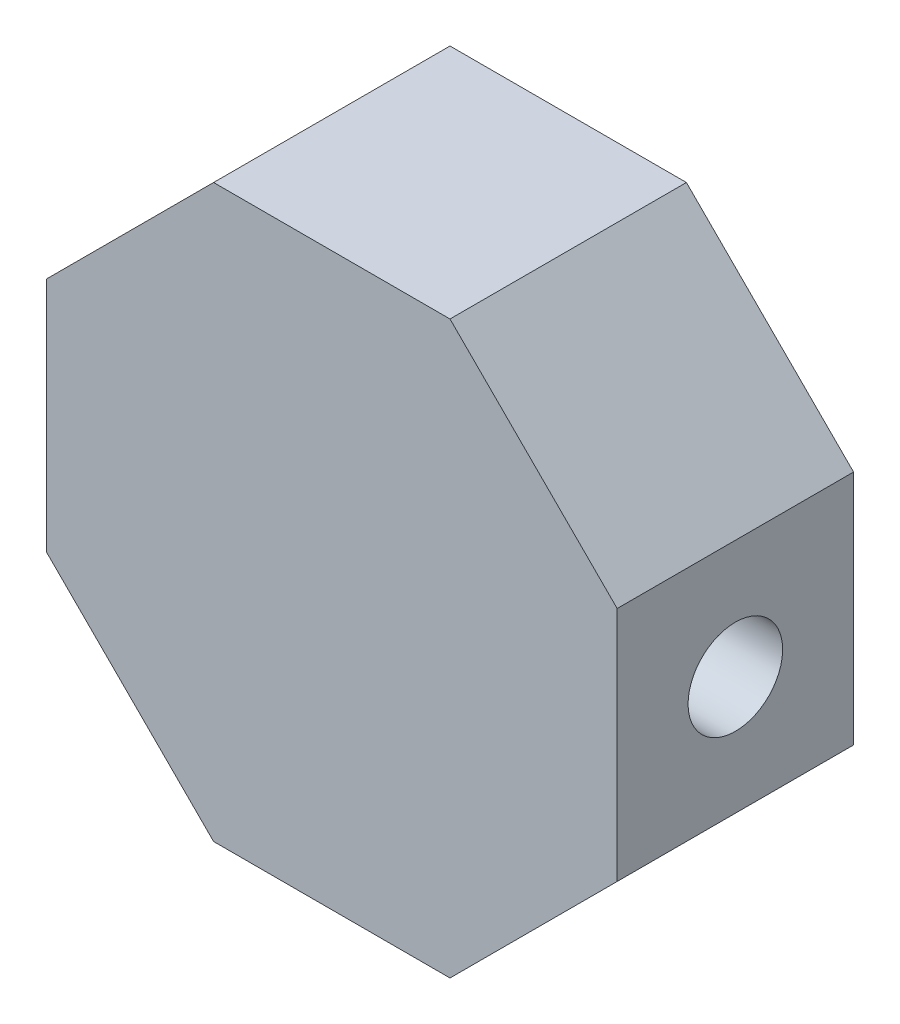
ISO-10303-21;
HEADER;
FILE_DESCRIPTION(('STEP AP214'),'2;1');
FILE_NAME('part.step','',(''),(''),'','','');
FILE_SCHEMA(('AUTOMOTIVE_DESIGN { 1 0 10303 214 1 1 1 1 }'));
ENDSEC;
DATA;
#1=APPLICATION_CONTEXT('core data for automotive mechanical design processes');
#2=APPLICATION_PROTOCOL_DEFINITION('international standard','automotive_design',2000,#1);
#3=PRODUCT_CONTEXT('',#1,'mechanical');
#4=PRODUCT('Part','Part','',(#3));
#5=PRODUCT_RELATED_PRODUCT_CATEGORY('part','',(#4));
#6=PRODUCT_DEFINITION_FORMATION('','',#4);
#7=PRODUCT_DEFINITION_CONTEXT('part definition',#1,'design');
#8=PRODUCT_DEFINITION('design','',#6,#7);
#9=PRODUCT_DEFINITION_SHAPE('','',#8);
#10=(LENGTH_UNIT() NAMED_UNIT(*) SI_UNIT(.MILLI.,.METRE.));
#11=(NAMED_UNIT(*) PLANE_ANGLE_UNIT() SI_UNIT($,.RADIAN.));
#12=(NAMED_UNIT(*) SI_UNIT($,.STERADIAN.) SOLID_ANGLE_UNIT());
#13=UNCERTAINTY_MEASURE_WITH_UNIT(LENGTH_MEASURE(1.E-05),#10,'distance_accuracy_value','');
#14=(GEOMETRIC_REPRESENTATION_CONTEXT(3) GLOBAL_UNCERTAINTY_ASSIGNED_CONTEXT((#13)) GLOBAL_UNIT_ASSIGNED_CONTEXT((#10,
#11,#12)) REPRESENTATION_CONTEXT('',''));
#15=CARTESIAN_POINT('',(0.,0.,0.));
#16=DIRECTION('',(0.,0.,1.));
#17=DIRECTION('',(1.,0.,0.));
#18=AXIS2_PLACEMENT_3D('',#15,#16,#17);
#19=CARTESIAN_POINT('',(6.34999999999999,15.3302561210691,12.7));
#20=DIRECTION('',(-0.707106781186548,-0.707106781186548,0.));
#21=DIRECTION('',(0.707106781186548,-0.707106781186548,0.));
#22=AXIS2_PLACEMENT_3D('',#19,#20,#21);
#23=PLANE('',#22);
#24=DIRECTION('',(-0.707106781186547,0.707106781186547,0.));
#25=VECTOR('',#24,1.);
#26=CARTESIAN_POINT('',(6.34999999999999,15.3302561210691,0.));
#27=LINE('',#26,#25);
#28=CARTESIAN_POINT('',(15.3302561210691,6.35,0.));
#29=VERTEX_POINT('',#28);
#30=CARTESIAN_POINT('',(6.34999999999999,15.3302561210691,0.));
#31=VERTEX_POINT('',#30);
#32=EDGE_CURVE('E148',#29,#31,#27,.T.);
#33=ORIENTED_EDGE('',*,*,#32,.T.);
#34=DIRECTION('',(0.,0.,-1.));
#35=VECTOR('',#34,1.);
#36=CARTESIAN_POINT('',(6.34999999999999,15.3302561210691,12.7));
#37=LINE('',#36,#35);
#38=CARTESIAN_POINT('',(6.34999999999999,15.3302561210691,12.7));
#39=VERTEX_POINT('',#38);
#40=EDGE_CURVE('E11',#39,#31,#37,.T.);
#41=ORIENTED_EDGE('',*,*,#40,.F.);
#42=DIRECTION('',(-0.707106781186547,0.707106781186547,0.));
#43=VECTOR('',#42,1.);
#44=CARTESIAN_POINT('',(6.34999999999999,15.3302561210691,12.7));
#45=LINE('',#44,#43);
#46=CARTESIAN_POINT('',(15.3302561210691,6.35,12.7));
#47=VERTEX_POINT('',#46);
#48=EDGE_CURVE('E171',#47,#39,#45,.T.);
#49=ORIENTED_EDGE('',*,*,#48,.F.);
#50=DIRECTION('',(0.,0.,-1.));
#51=VECTOR('',#50,1.);
#52=CARTESIAN_POINT('',(15.3302561210691,6.35,12.7));
#53=LINE('',#52,#51);
#54=EDGE_CURVE('E144',#47,#29,#53,.T.);
#55=ORIENTED_EDGE('',*,*,#54,.T.);
#56=EDGE_LOOP('',(#33,#41,#49,#55));
#57=FACE_BOUND('',#56,.T.);
#58=ADVANCED_FACE('F39',(#57),#23,.F.);
#59=CARTESIAN_POINT('',(-6.35000000000001,15.3302561210691,12.7));
#60=DIRECTION('',(0.,-1.,0.));
#61=DIRECTION('',(1.,0.,0.));
#62=AXIS2_PLACEMENT_3D('',#59,#60,#61);
#63=PLANE('',#62);
#64=DIRECTION('',(-1.,0.,0.));
#65=VECTOR('',#64,1.);
#66=CARTESIAN_POINT('',(-6.35000000000001,15.3302561210691,0.));
#67=LINE('',#66,#65);
#68=CARTESIAN_POINT('',(-6.35000000000001,15.3302561210691,0.));
#69=VERTEX_POINT('',#68);
#70=EDGE_CURVE('E152',#31,#69,#67,.T.);
#71=ORIENTED_EDGE('',*,*,#70,.T.);
#72=DIRECTION('',(0.,0.,-1.));
#73=VECTOR('',#72,1.);
#74=CARTESIAN_POINT('',(-6.35000000000001,15.3302561210691,12.7));
#75=LINE('',#74,#73);
#76=CARTESIAN_POINT('',(-6.35000000000001,15.3302561210691,12.7));
#77=VERTEX_POINT('',#76);
#78=EDGE_CURVE('E47',#77,#69,#75,.T.);
#79=ORIENTED_EDGE('',*,*,#78,.F.);
#80=DIRECTION('',(-1.,0.,0.));
#81=VECTOR('',#80,1.);
#82=CARTESIAN_POINT('',(-6.35000000000001,15.3302561210691,12.7));
#83=LINE('',#82,#81);
#84=EDGE_CURVE('E105',#39,#77,#83,.T.);
#85=ORIENTED_EDGE('',*,*,#84,.F.);
#86=ORIENTED_EDGE('',*,*,#40,.T.);
#87=EDGE_LOOP('',(#71,#79,#85,#86));
#88=FACE_BOUND('',#87,.T.);
#89=ADVANCED_FACE('F237',(#88),#63,.F.);
#90=CARTESIAN_POINT('',(-15.3302561210692,6.34999999999999,12.7));
#91=DIRECTION('',(0.707106781186547,-0.707106781186548,0.));
#92=DIRECTION('',(0.707106781186548,0.707106781186547,0.));
#93=AXIS2_PLACEMENT_3D('',#90,#91,#92);
#94=PLANE('',#93);
#95=DIRECTION('',(-0.707106781186548,-0.707106781186547,0.));
#96=VECTOR('',#95,1.);
#97=CARTESIAN_POINT('',(-15.3302561210692,6.34999999999999,0.));
#98=LINE('',#97,#96);
#99=CARTESIAN_POINT('',(-15.3302561210692,6.34999999999999,0.));
#100=VERTEX_POINT('',#99);
#101=EDGE_CURVE('E156',#69,#100,#98,.T.);
#102=ORIENTED_EDGE('',*,*,#101,.T.);
#103=DIRECTION('',(0.,0.,-1.));
#104=VECTOR('',#103,1.);
#105=CARTESIAN_POINT('',(-15.3302561210692,6.34999999999999,12.7));
#106=LINE('',#105,#104);
#107=CARTESIAN_POINT('',(-15.3302561210692,6.34999999999999,12.7));
#108=VERTEX_POINT('',#107);
#109=EDGE_CURVE('E181',#108,#100,#106,.T.);
#110=ORIENTED_EDGE('',*,*,#109,.F.);
#111=DIRECTION('',(-0.707106781186548,-0.707106781186547,0.));
#112=VECTOR('',#111,1.);
#113=CARTESIAN_POINT('',(-15.3302561210692,6.34999999999999,12.7));
#114=LINE('',#113,#112);
#115=EDGE_CURVE('E192',#77,#108,#114,.T.);
#116=ORIENTED_EDGE('',*,*,#115,.F.);
#117=ORIENTED_EDGE('',*,*,#78,.T.);
#118=EDGE_LOOP('',(#102,#110,#116,#117));
#119=FACE_BOUND('',#118,.T.);
#120=ADVANCED_FACE('F190',(#119),#94,.F.);
#121=CARTESIAN_POINT('',(-15.3302561210692,-6.35,12.7));
#122=DIRECTION('',(1.,0.,0.));
#123=DIRECTION('',(0.,0.,-1.));
#124=AXIS2_PLACEMENT_3D('',#121,#122,#123);
#125=PLANE('',#124);
#126=DIRECTION('',(0.,-1.,0.));
#127=VECTOR('',#126,1.);
#128=CARTESIAN_POINT('',(-15.3302561210692,-6.35,0.));
#129=LINE('',#128,#127);
#130=CARTESIAN_POINT('',(-15.3302561210692,-6.35,0.));
#131=VERTEX_POINT('',#130);
#132=EDGE_CURVE('E159',#100,#131,#129,.T.);
#133=ORIENTED_EDGE('',*,*,#132,.T.);
#134=DIRECTION('',(0.,0.,-1.));
#135=VECTOR('',#134,1.);
#136=CARTESIAN_POINT('',(-15.3302561210692,-6.35,12.7));
#137=LINE('',#136,#135);
#138=CARTESIAN_POINT('',(-15.3302561210692,-6.35,12.7));
#139=VERTEX_POINT('',#138);
#140=EDGE_CURVE('E178',#139,#131,#137,.T.);
#141=ORIENTED_EDGE('',*,*,#140,.F.);
#142=DIRECTION('',(0.,-1.,0.));
#143=VECTOR('',#142,1.);
#144=CARTESIAN_POINT('',(-15.3302561210692,-6.35,12.7));
#145=LINE('',#144,#143);
#146=EDGE_CURVE('E204',#108,#139,#145,.T.);
#147=ORIENTED_EDGE('',*,*,#146,.F.);
#148=ORIENTED_EDGE('',*,*,#109,.T.);
#149=EDGE_LOOP('',(#133,#141,#147,#148));
#150=FACE_BOUND('',#149,.T.);
#151=ADVANCED_FACE('F200',(#150),#125,.F.);
#152=CARTESIAN_POINT('',(-6.35000000000001,-15.3302561210691,12.7));
#153=DIRECTION('',(0.707106781186548,0.707106781186548,0.));
#154=DIRECTION('',(-0.707106781186548,0.707106781186548,0.));
#155=AXIS2_PLACEMENT_3D('',#152,#153,#154);
#156=PLANE('',#155);
#157=DIRECTION('',(0.707106781186548,-0.707106781186548,0.));
#158=VECTOR('',#157,1.);
#159=CARTESIAN_POINT('',(-6.35000000000001,-15.3302561210691,0.));
#160=LINE('',#159,#158);
#161=CARTESIAN_POINT('',(-6.35000000000001,-15.3302561210691,0.));
#162=VERTEX_POINT('',#161);
#163=EDGE_CURVE('E162',#131,#162,#160,.T.);
#164=ORIENTED_EDGE('',*,*,#163,.T.);
#165=DIRECTION('',(0.,0.,-1.));
#166=VECTOR('',#165,1.);
#167=CARTESIAN_POINT('',(-6.35000000000001,-15.3302561210691,12.7));
#168=LINE('',#167,#166);
#169=CARTESIAN_POINT('',(-6.35000000000001,-15.3302561210691,12.7));
#170=VERTEX_POINT('',#169);
#171=EDGE_CURVE('E137',#170,#162,#168,.T.);
#172=ORIENTED_EDGE('',*,*,#171,.F.);
#173=DIRECTION('',(0.707106781186548,-0.707106781186548,0.));
#174=VECTOR('',#173,1.);
#175=CARTESIAN_POINT('',(-6.35000000000001,-15.3302561210691,12.7));
#176=LINE('',#175,#174);
#177=EDGE_CURVE('E126',#139,#170,#176,.T.);
#178=ORIENTED_EDGE('',*,*,#177,.F.);
#179=ORIENTED_EDGE('',*,*,#140,.T.);
#180=EDGE_LOOP('',(#164,#172,#178,#179));
#181=FACE_BOUND('',#180,.T.);
#182=ADVANCED_FACE('F203',(#181),#156,.F.);
#183=CARTESIAN_POINT('',(6.34999999999998,-15.3302561210692,12.7));
#184=DIRECTION('',(0.,1.,0.));
#185=DIRECTION('',(-1.,0.,0.));
#186=AXIS2_PLACEMENT_3D('',#183,#184,#185);
#187=PLANE('',#186);
#188=DIRECTION('',(1.,0.,0.));
#189=VECTOR('',#188,1.);
#190=CARTESIAN_POINT('',(6.34999999999998,-15.3302561210692,0.));
#191=LINE('',#190,#189);
#192=CARTESIAN_POINT('',(6.34999999999998,-15.3302561210692,0.));
#193=VERTEX_POINT('',#192);
#194=EDGE_CURVE('E135',#162,#193,#191,.T.);
#195=ORIENTED_EDGE('',*,*,#194,.T.);
#196=DIRECTION('',(0.,0.,-1.));
#197=VECTOR('',#196,1.);
#198=CARTESIAN_POINT('',(6.34999999999998,-15.3302561210692,12.7));
#199=LINE('',#198,#197);
#200=CARTESIAN_POINT('',(6.34999999999998,-15.3302561210692,12.7));
#201=VERTEX_POINT('',#200);
#202=EDGE_CURVE('E132',#201,#193,#199,.T.);
#203=ORIENTED_EDGE('',*,*,#202,.F.);
#204=DIRECTION('',(1.,0.,0.));
#205=VECTOR('',#204,1.);
#206=CARTESIAN_POINT('',(6.34999999999998,-15.3302561210692,12.7));
#207=LINE('',#206,#205);
#208=EDGE_CURVE('E120',#170,#201,#207,.T.);
#209=ORIENTED_EDGE('',*,*,#208,.F.);
#210=ORIENTED_EDGE('',*,*,#171,.T.);
#211=EDGE_LOOP('',(#195,#203,#209,#210));
#212=FACE_BOUND('',#211,.T.);
#213=ADVANCED_FACE('F133',(#212),#187,.F.);
#214=CARTESIAN_POINT('',(15.3302561210691,-6.35,12.7));
#215=DIRECTION('',(-0.707106781186547,0.707106781186548,0.));
#216=DIRECTION('',(-0.707106781186548,-0.707106781186547,0.));
#217=AXIS2_PLACEMENT_3D('',#214,#215,#216);
#218=PLANE('',#217);
#219=DIRECTION('',(0.707106781186548,0.707106781186547,0.));
#220=VECTOR('',#219,1.);
#221=CARTESIAN_POINT('',(15.3302561210691,-6.35,0.));
#222=LINE('',#221,#220);
#223=CARTESIAN_POINT('',(15.3302561210691,-6.35,0.));
#224=VERTEX_POINT('',#223);
#225=EDGE_CURVE('E90',#193,#224,#222,.T.);
#226=ORIENTED_EDGE('',*,*,#225,.T.);
#227=DIRECTION('',(0.,0.,-1.));
#228=VECTOR('',#227,1.);
#229=CARTESIAN_POINT('',(15.3302561210691,-6.35,12.7));
#230=LINE('',#229,#228);
#231=CARTESIAN_POINT('',(15.3302561210691,-6.35,12.7));
#232=VERTEX_POINT('',#231);
#233=EDGE_CURVE('E138',#232,#224,#230,.T.);
#234=ORIENTED_EDGE('',*,*,#233,.F.);
#235=DIRECTION('',(0.707106781186548,0.707106781186547,0.));
#236=VECTOR('',#235,1.);
#237=CARTESIAN_POINT('',(15.3302561210691,-6.35,12.7));
#238=LINE('',#237,#236);
#239=EDGE_CURVE('E124',#201,#232,#238,.T.);
#240=ORIENTED_EDGE('',*,*,#239,.F.);
#241=ORIENTED_EDGE('',*,*,#202,.T.);
#242=EDGE_LOOP('',(#226,#234,#240,#241));
#243=FACE_BOUND('',#242,.T.);
#244=ADVANCED_FACE('F140',(#243),#218,.F.);
#245=CARTESIAN_POINT('',(15.3302561210691,6.35,12.7));
#246=DIRECTION('',(-1.,0.,0.));
#247=DIRECTION('',(0.,-1.,0.));
#248=AXIS2_PLACEMENT_3D('',#245,#246,#247);
#249=PLANE('',#248);
#250=CARTESIAN_POINT('',(15.3302561210691,0.,6.35));
#251=DIRECTION('',(1.,0.,0.));
#252=DIRECTION('',(0.,1.,0.));
#253=AXIS2_PLACEMENT_3D('',#250,#251,#252);
#254=CIRCLE('',#253,2.54);
#255=CARTESIAN_POINT('',(15.3302561210691,2.54,6.35));
#256=VERTEX_POINT('',#255);
#257=EDGE_CURVE('E210',#256,#256,#254,.T.);
#258=ORIENTED_EDGE('',*,*,#257,.F.);
#259=EDGE_LOOP('',(#258));
#260=FACE_BOUND('',#259,.T.);
#261=DIRECTION('',(0.,1.,0.));
#262=VECTOR('',#261,1.);
#263=CARTESIAN_POINT('',(15.3302561210691,6.35,0.));
#264=LINE('',#263,#262);
#265=EDGE_CURVE('E97',#224,#29,#264,.T.);
#266=ORIENTED_EDGE('',*,*,#265,.T.);
#267=ORIENTED_EDGE('',*,*,#54,.F.);
#268=DIRECTION('',(0.,1.,0.));
#269=VECTOR('',#268,1.);
#270=CARTESIAN_POINT('',(15.3302561210691,6.35,12.7));
#271=LINE('',#270,#269);
#272=EDGE_CURVE('E55',#232,#47,#271,.T.);
#273=ORIENTED_EDGE('',*,*,#272,.F.);
#274=ORIENTED_EDGE('',*,*,#233,.T.);
#275=EDGE_LOOP('',(#266,#267,#273,#274));
#276=FACE_BOUND('',#275,.T.);
#277=ADVANCED_FACE('F226',(#260,#276),#249,.F.);
#278=CARTESIAN_POINT('',(0.,0.,12.7));
#279=DIRECTION('',(0.,0.,-1.));
#280=DIRECTION('',(-1.,0.,0.));
#281=AXIS2_PLACEMENT_3D('',#278,#279,#280);
#282=PLANE('',#281);
#283=ORIENTED_EDGE('',*,*,#48,.T.);
#284=ORIENTED_EDGE('',*,*,#84,.T.);
#285=ORIENTED_EDGE('',*,*,#115,.T.);
#286=ORIENTED_EDGE('',*,*,#146,.T.);
#287=ORIENTED_EDGE('',*,*,#177,.T.);
#288=ORIENTED_EDGE('',*,*,#208,.T.);
#289=ORIENTED_EDGE('',*,*,#239,.T.);
#290=ORIENTED_EDGE('',*,*,#272,.T.);
#291=EDGE_LOOP('',(#283,#284,#285,#286,#287,#288,#289,#290));
#292=FACE_BOUND('',#291,.T.);
#293=ADVANCED_FACE('F122',(#292),#282,.F.);
#294=CARTESIAN_POINT('',(0.,0.,0.));
#295=DIRECTION('',(0.,0.,-1.));
#296=DIRECTION('',(-1.,0.,0.));
#297=AXIS2_PLACEMENT_3D('',#294,#295,#296);
#298=PLANE('',#297);
#299=ORIENTED_EDGE('',*,*,#32,.F.);
#300=ORIENTED_EDGE('',*,*,#265,.F.);
#301=ORIENTED_EDGE('',*,*,#225,.F.);
#302=ORIENTED_EDGE('',*,*,#194,.F.);
#303=ORIENTED_EDGE('',*,*,#163,.F.);
#304=ORIENTED_EDGE('',*,*,#132,.F.);
#305=ORIENTED_EDGE('',*,*,#101,.F.);
#306=ORIENTED_EDGE('',*,*,#70,.F.);
#307=EDGE_LOOP('',(#299,#300,#301,#302,#303,#304,#305,#306));
#308=FACE_BOUND('',#307,.T.);
#309=ADVANCED_FACE('F196',(#308),#298,.T.);
#310=CARTESIAN_POINT('',(2.63025612106914,0.,6.35));
#311=DIRECTION('',(1.,0.,0.));
#312=DIRECTION('',(0.,1.,0.));
#313=AXIS2_PLACEMENT_3D('',#310,#311,#312);
#314=CYLINDRICAL_SURFACE('',#313,2.54);
#315=CARTESIAN_POINT('',(2.63025612106914,0.,6.35));
#316=DIRECTION('',(1.,0.,0.));
#317=DIRECTION('',(0.,1.,0.));
#318=AXIS2_PLACEMENT_3D('',#315,#316,#317);
#319=CIRCLE('',#318,2.54);
#320=CARTESIAN_POINT('',(2.63025612106914,2.53999999999999,6.35));
#321=VERTEX_POINT('',#320);
#322=EDGE_CURVE('E153',#321,#321,#319,.T.);
#323=ORIENTED_EDGE('',*,*,#322,.F.);
#324=EDGE_LOOP('',(#323));
#325=FACE_BOUND('',#324,.T.);
#326=ORIENTED_EDGE('',*,*,#257,.T.);
#327=EDGE_LOOP('',(#326));
#328=FACE_BOUND('',#327,.T.);
#329=ADVANCED_FACE('F220',(#325,#328),#314,.F.);
#330=CARTESIAN_POINT('',(2.63025612106914,0.,6.35));
#331=DIRECTION('',(1.,0.,0.));
#332=DIRECTION('',(0.,1.,0.));
#333=AXIS2_PLACEMENT_3D('',#330,#331,#332);
#334=PLANE('',#333);
#335=ORIENTED_EDGE('',*,*,#322,.T.);
#336=EDGE_LOOP('',(#335));
#337=FACE_BOUND('',#336,.T.);
#338=ADVANCED_FACE('F218',(#337),#334,.T.);
#339=CLOSED_SHELL('',(#58,#89,#120,#151,#182,#213,#244,#277,#293,#309,#329,#338));
#340=MANIFOLD_SOLID_BREP('B2',#339);
#341=ADVANCED_BREP_SHAPE_REPRESENTATION('',(#18,#340),#14);
#342=SHAPE_DEFINITION_REPRESENTATION(#9,#341);
ENDSEC;
END-ISO-10303-21;
